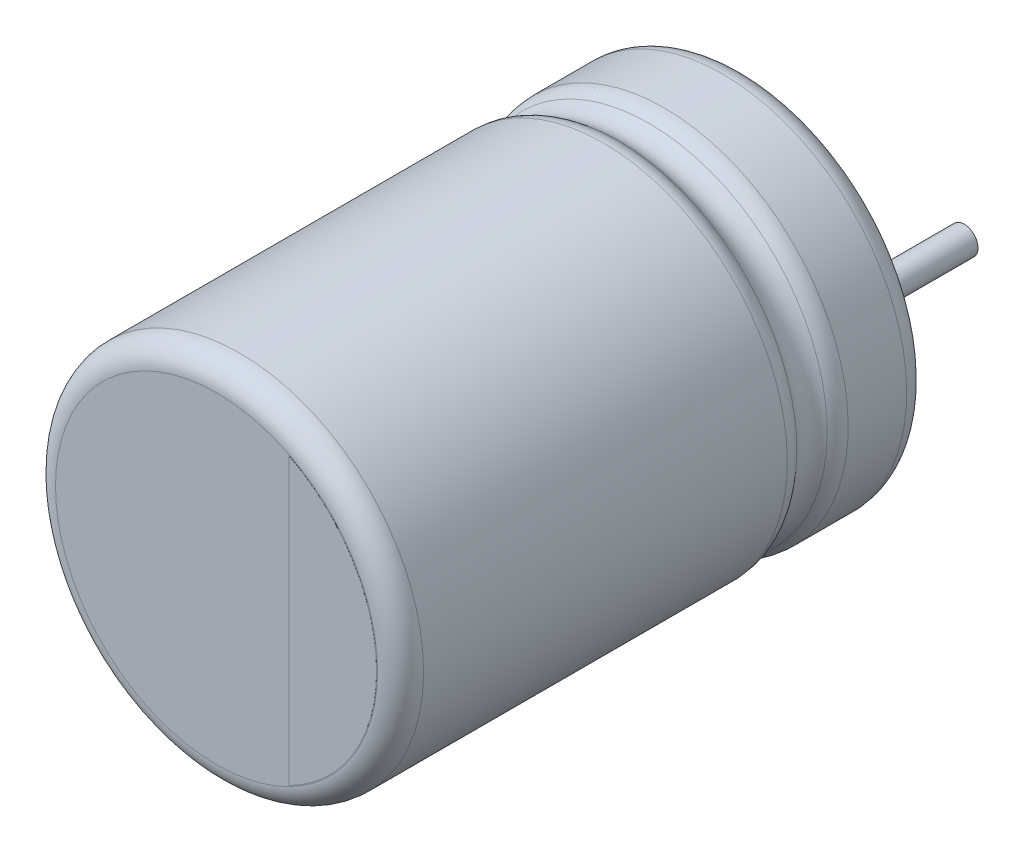
ISO-10303-21;
HEADER;
FILE_DESCRIPTION(('STEP AP214'),'2;1');
FILE_NAME('part.step','',(''),(''),'','','');
FILE_SCHEMA(('AUTOMOTIVE_DESIGN { 1 0 10303 214 1 1 1 1 }'));
ENDSEC;
DATA;
#1=APPLICATION_CONTEXT('core data for automotive mechanical design processes');
#2=APPLICATION_PROTOCOL_DEFINITION('international standard','automotive_design',2000,#1);
#3=PRODUCT_CONTEXT('',#1,'mechanical');
#4=PRODUCT('Part','Part','',(#3));
#5=PRODUCT_RELATED_PRODUCT_CATEGORY('part','',(#4));
#6=PRODUCT_DEFINITION_FORMATION('','',#4);
#7=PRODUCT_DEFINITION_CONTEXT('part definition',#1,'design');
#8=PRODUCT_DEFINITION('design','',#6,#7);
#9=PRODUCT_DEFINITION_SHAPE('','',#8);
#10=(LENGTH_UNIT() NAMED_UNIT(*) SI_UNIT(.MILLI.,.METRE.));
#11=(NAMED_UNIT(*) PLANE_ANGLE_UNIT() SI_UNIT($,.RADIAN.));
#12=(NAMED_UNIT(*) SI_UNIT($,.STERADIAN.) SOLID_ANGLE_UNIT());
#13=UNCERTAINTY_MEASURE_WITH_UNIT(LENGTH_MEASURE(1.E-05),#10,'distance_accuracy_value','');
#14=(GEOMETRIC_REPRESENTATION_CONTEXT(3) GLOBAL_UNCERTAINTY_ASSIGNED_CONTEXT((#13)) GLOBAL_UNIT_ASSIGNED_CONTEXT((#10,
#11,#12)) REPRESENTATION_CONTEXT('',''));
#15=CARTESIAN_POINT('',(0.,0.,0.));
#16=DIRECTION('',(0.,0.,1.));
#17=DIRECTION('',(1.,0.,0.));
#18=AXIS2_PLACEMENT_3D('',#15,#16,#17);
#19=CARTESIAN_POINT('',(3.,0.,11.5));
#20=DIRECTION('',(0.,0.,1.));
#21=DIRECTION('',(1.,0.,0.));
#22=AXIS2_PLACEMENT_3D('',#19,#20,#21);
#23=PLANE('',#22);
#24=CARTESIAN_POINT('',(0.,0.,11.5));
#25=DIRECTION('',(0.,0.,-1.));
#26=DIRECTION('',(0.,1.,0.));
#27=AXIS2_PLACEMENT_3D('',#24,#25,#26);
#28=CIRCLE('',#27,3.5);
#29=CARTESIAN_POINT('',(0.,3.5,11.5));
#30=VERTEX_POINT('',#29);
#31=EDGE_CURVE('E39',#30,#30,#28,.T.);
#32=ORIENTED_EDGE('',*,*,#31,.F.);
#33=EDGE_LOOP('',(#32));
#34=FACE_BOUND('',#33,.T.);
#35=DIRECTION('',(0.,-1.,0.));
#36=VECTOR('',#35,1.);
#37=CARTESIAN_POINT('',(1.5758347232,3.103007768,11.5));
#38=LINE('',#37,#36);
#39=CARTESIAN_POINT('',(1.5758347232,3.103007768,11.5));
#40=VERTEX_POINT('',#39);
#41=CARTESIAN_POINT('',(1.5758347232,-3.103007768,11.5));
#42=VERTEX_POINT('',#41);
#43=EDGE_CURVE('E136',#40,#42,#38,.T.);
#44=ORIENTED_EDGE('',*,*,#43,.F.);
#45=CARTESIAN_POINT('',(0.,0.,11.5));
#46=DIRECTION('',(0.,0.,1.));
#47=DIRECTION('',(1.,0.,0.));
#48=AXIS2_PLACEMENT_3D('',#45,#46,#47);
#49=CIRCLE('',#48,3.4802172753);
#50=EDGE_CURVE('E132',#42,#40,#49,.T.);
#51=ORIENTED_EDGE('',*,*,#50,.F.);
#52=EDGE_LOOP('',(#44,#51));
#53=FACE_BOUND('',#52,.T.);
#54=ADVANCED_FACE('F16',(#34,#53),#23,.T.);
#55=CARTESIAN_POINT('',(3.5,0.,0.));
#56=DIRECTION('',(0.,0.,-1.));
#57=DIRECTION('',(0.,-1.,0.));
#58=AXIS2_PLACEMENT_3D('',#55,#56,#57);
#59=PLANE('',#58);
#60=CARTESIAN_POINT('',(-1.75,0.,0.));
#61=DIRECTION('',(0.,0.,-1.));
#62=DIRECTION('',(0.,1.,0.));
#63=AXIS2_PLACEMENT_3D('',#60,#61,#62);
#64=CIRCLE('',#63,0.3);
#65=CARTESIAN_POINT('',(-1.75,0.3,0.));
#66=VERTEX_POINT('',#65);
#67=EDGE_CURVE('E125',#66,#66,#64,.T.);
#68=ORIENTED_EDGE('',*,*,#67,.F.);
#69=EDGE_LOOP('',(#68));
#70=FACE_BOUND('',#69,.T.);
#71=CARTESIAN_POINT('',(0.,0.,0.));
#72=DIRECTION('',(0.,0.,-1.));
#73=DIRECTION('',(0.,1.,0.));
#74=AXIS2_PLACEMENT_3D('',#71,#72,#73);
#75=CIRCLE('',#74,3.5);
#76=CARTESIAN_POINT('',(0.,3.5,0.));
#77=VERTEX_POINT('',#76);
#78=EDGE_CURVE('E10',#77,#77,#75,.T.);
#79=ORIENTED_EDGE('',*,*,#78,.T.);
#80=EDGE_LOOP('',(#79));
#81=FACE_BOUND('',#80,.T.);
#82=CARTESIAN_POINT('',(1.75,0.,0.));
#83=DIRECTION('',(0.,0.,-1.));
#84=DIRECTION('',(0.,-1.,0.));
#85=AXIS2_PLACEMENT_3D('',#82,#83,#84);
#86=CIRCLE('',#85,0.3);
#87=CARTESIAN_POINT('',(1.75,-0.3,0.));
#88=VERTEX_POINT('',#87);
#89=EDGE_CURVE('E131',#88,#88,#86,.T.);
#90=ORIENTED_EDGE('',*,*,#89,.F.);
#91=EDGE_LOOP('',(#90));
#92=FACE_BOUND('',#91,.T.);
#93=ADVANCED_FACE('F184',(#70,#81,#92),#59,.T.);
#94=CARTESIAN_POINT('',(0.,0.,0.5));
#95=DIRECTION('',(0.,0.,-1.));
#96=DIRECTION('',(0.,1.,0.));
#97=AXIS2_PLACEMENT_3D('',#94,#95,#96);
#98=TOROIDAL_SURFACE('',#97,3.5,0.5);
#99=CARTESIAN_POINT('',(0.,0.,0.5));
#100=DIRECTION('',(0.,0.,-1.));
#101=DIRECTION('',(0.,1.,0.));
#102=AXIS2_PLACEMENT_3D('',#99,#100,#101);
#103=CIRCLE('',#102,4.);
#104=CARTESIAN_POINT('',(0.,4.,0.5));
#105=VERTEX_POINT('',#104);
#106=EDGE_CURVE('E27',#105,#105,#103,.T.);
#107=ORIENTED_EDGE('',*,*,#106,.T.);
#108=EDGE_LOOP('',(#107));
#109=FACE_BOUND('',#108,.T.);
#110=ORIENTED_EDGE('',*,*,#78,.F.);
#111=EDGE_LOOP('',(#110));
#112=FACE_BOUND('',#111,.T.);
#113=ADVANCED_FACE('F180',(#109,#112),#98,.T.);
#114=CARTESIAN_POINT('',(0.,0.,0.));
#115=DIRECTION('',(0.,0.,-1.));
#116=DIRECTION('',(0.,1.,0.));
#117=AXIS2_PLACEMENT_3D('',#114,#115,#116);
#118=CYLINDRICAL_SURFACE('',#117,4.);
#119=CARTESIAN_POINT('',(0.,0.,1.7715748741));
#120=DIRECTION('',(0.,0.,-1.));
#121=DIRECTION('',(0.,1.,0.));
#122=AXIS2_PLACEMENT_3D('',#119,#120,#121);
#123=CIRCLE('',#122,4.);
#124=CARTESIAN_POINT('',(0.,4.,1.7715748741));
#125=VERTEX_POINT('',#124);
#126=EDGE_CURVE('E58',#125,#125,#123,.T.);
#127=ORIENTED_EDGE('',*,*,#126,.T.);
#128=EDGE_LOOP('',(#127));
#129=FACE_BOUND('',#128,.T.);
#130=ORIENTED_EDGE('',*,*,#106,.F.);
#131=EDGE_LOOP('',(#130));
#132=FACE_BOUND('',#131,.T.);
#133=ADVANCED_FACE('F183',(#129,#132),#118,.T.);
#134=CARTESIAN_POINT('',(0.,0.,1.7715748741));
#135=DIRECTION('',(0.,0.,-1.));
#136=DIRECTION('',(0.,1.,0.));
#137=AXIS2_PLACEMENT_3D('',#134,#135,#136);
#138=TOROIDAL_SURFACE('',#137,3.5,0.5);
#139=CARTESIAN_POINT('',(0.,0.,2.102293788));
#140=DIRECTION('',(0.,0.,-1.));
#141=DIRECTION('',(0.,1.,0.));
#142=AXIS2_PLACEMENT_3D('',#139,#140,#141);
#143=CIRCLE('',#142,3.875);
#144=CARTESIAN_POINT('',(0.,3.875,2.102293788));
#145=VERTEX_POINT('',#144);
#146=EDGE_CURVE('E152',#145,#145,#143,.T.);
#147=ORIENTED_EDGE('',*,*,#146,.T.);
#148=EDGE_LOOP('',(#147));
#149=FACE_BOUND('',#148,.T.);
#150=ORIENTED_EDGE('',*,*,#126,.F.);
#151=EDGE_LOOP('',(#150));
#152=FACE_BOUND('',#151,.T.);
#153=ADVANCED_FACE('F369',(#149,#152),#138,.T.);
#154=CARTESIAN_POINT('',(0.,0.,2.4330127019));
#155=DIRECTION('',(0.,0.,-1.));
#156=DIRECTION('',(0.,1.,0.));
#157=AXIS2_PLACEMENT_3D('',#154,#155,#156);
#158=TOROIDAL_SURFACE('',#157,4.25,0.5);
#159=CARTESIAN_POINT('',(0.,0.,2.7637316158));
#160=DIRECTION('',(0.,0.,-1.));
#161=DIRECTION('',(0.,1.,0.));
#162=AXIS2_PLACEMENT_3D('',#159,#160,#161);
#163=CIRCLE('',#162,3.875);
#164=CARTESIAN_POINT('',(0.,3.875,2.7637316158));
#165=VERTEX_POINT('',#164);
#166=EDGE_CURVE('E124',#165,#165,#163,.T.);
#167=ORIENTED_EDGE('',*,*,#166,.T.);
#168=EDGE_LOOP('',(#167));
#169=FACE_BOUND('',#168,.T.);
#170=ORIENTED_EDGE('',*,*,#146,.F.);
#171=EDGE_LOOP('',(#170));
#172=FACE_BOUND('',#171,.T.);
#173=ADVANCED_FACE('F229',(#169,#172),#158,.F.);
#174=CARTESIAN_POINT('',(0.,0.,3.0944505297));
#175=DIRECTION('',(0.,0.,-1.));
#176=DIRECTION('',(0.,1.,0.));
#177=AXIS2_PLACEMENT_3D('',#174,#175,#176);
#178=TOROIDAL_SURFACE('',#177,3.5,0.5);
#179=CARTESIAN_POINT('',(0.,0.,3.0944505297));
#180=DIRECTION('',(0.,0.,-1.));
#181=DIRECTION('',(0.,1.,0.));
#182=AXIS2_PLACEMENT_3D('',#179,#180,#181);
#183=CIRCLE('',#182,4.);
#184=CARTESIAN_POINT('',(0.,4.,3.0944505297));
#185=VERTEX_POINT('',#184);
#186=EDGE_CURVE('E20',#185,#185,#183,.T.);
#187=ORIENTED_EDGE('',*,*,#186,.T.);
#188=EDGE_LOOP('',(#187));
#189=FACE_BOUND('',#188,.T.);
#190=ORIENTED_EDGE('',*,*,#166,.F.);
#191=EDGE_LOOP('',(#190));
#192=FACE_BOUND('',#191,.T.);
#193=ADVANCED_FACE('F221',(#189,#192),#178,.T.);
#194=CARTESIAN_POINT('',(0.,0.,0.));
#195=DIRECTION('',(0.,0.,-1.));
#196=DIRECTION('',(0.,1.,0.));
#197=AXIS2_PLACEMENT_3D('',#194,#195,#196);
#198=CYLINDRICAL_SURFACE('',#197,4.);
#199=CARTESIAN_POINT('',(0.,0.,11.));
#200=DIRECTION('',(0.,0.,-1.));
#201=DIRECTION('',(0.,1.,0.));
#202=AXIS2_PLACEMENT_3D('',#199,#200,#201);
#203=CIRCLE('',#202,4.);
#204=CARTESIAN_POINT('',(0.,4.,11.));
#205=VERTEX_POINT('',#204);
#206=EDGE_CURVE('E113',#205,#205,#203,.T.);
#207=ORIENTED_EDGE('',*,*,#206,.T.);
#208=EDGE_LOOP('',(#207));
#209=FACE_BOUND('',#208,.T.);
#210=ORIENTED_EDGE('',*,*,#186,.F.);
#211=EDGE_LOOP('',(#210));
#212=FACE_BOUND('',#211,.T.);
#213=ADVANCED_FACE('F219',(#209,#212),#198,.T.);
#214=CARTESIAN_POINT('',(0.,0.,11.));
#215=DIRECTION('',(0.,0.,-1.));
#216=DIRECTION('',(0.,1.,0.));
#217=AXIS2_PLACEMENT_3D('',#214,#215,#216);
#218=TOROIDAL_SURFACE('',#217,3.5,0.5);
#219=ORIENTED_EDGE('',*,*,#31,.T.);
#220=EDGE_LOOP('',(#219));
#221=FACE_BOUND('',#220,.T.);
#222=ORIENTED_EDGE('',*,*,#206,.F.);
#223=EDGE_LOOP('',(#222));
#224=FACE_BOUND('',#223,.T.);
#225=ADVANCED_FACE('F114',(#221,#224),#218,.T.);
#226=CARTESIAN_POINT('',(-1.75,0.,-3.));
#227=DIRECTION('',(0.,0.,1.));
#228=DIRECTION('',(0.,-1.,0.));
#229=AXIS2_PLACEMENT_3D('',#226,#227,#228);
#230=CYLINDRICAL_SURFACE('',#229,0.3);
#231=CARTESIAN_POINT('',(-1.75,0.,-3.));
#232=DIRECTION('',(0.,0.,-1.));
#233=DIRECTION('',(0.,1.,0.));
#234=AXIS2_PLACEMENT_3D('',#231,#232,#233);
#235=CIRCLE('',#234,0.3);
#236=CARTESIAN_POINT('',(-1.75,0.3,-3.));
#237=VERTEX_POINT('',#236);
#238=EDGE_CURVE('E138',#237,#237,#235,.T.);
#239=ORIENTED_EDGE('',*,*,#238,.F.);
#240=EDGE_LOOP('',(#239));
#241=FACE_BOUND('',#240,.T.);
#242=ORIENTED_EDGE('',*,*,#67,.T.);
#243=EDGE_LOOP('',(#242));
#244=FACE_BOUND('',#243,.T.);
#245=ADVANCED_FACE('F205',(#241,#244),#230,.T.);
#246=CARTESIAN_POINT('',(-1.75,0.,-3.));
#247=DIRECTION('',(0.,0.,-1.));
#248=DIRECTION('',(0.,-1.,0.));
#249=AXIS2_PLACEMENT_3D('',#246,#247,#248);
#250=PLANE('',#249);
#251=ORIENTED_EDGE('',*,*,#238,.T.);
#252=EDGE_LOOP('',(#251));
#253=FACE_BOUND('',#252,.T.);
#254=ADVANCED_FACE('F18',(#253),#250,.T.);
#255=CARTESIAN_POINT('',(1.75,0.,-3.));
#256=DIRECTION('',(0.,0.,1.));
#257=DIRECTION('',(0.,-1.,0.));
#258=AXIS2_PLACEMENT_3D('',#255,#256,#257);
#259=CYLINDRICAL_SURFACE('',#258,0.3);
#260=CARTESIAN_POINT('',(1.75,0.,-3.));
#261=DIRECTION('',(0.,0.,-1.));
#262=DIRECTION('',(0.,-1.,0.));
#263=AXIS2_PLACEMENT_3D('',#260,#261,#262);
#264=CIRCLE('',#263,0.3);
#265=CARTESIAN_POINT('',(1.75,-0.3,-3.));
#266=VERTEX_POINT('',#265);
#267=EDGE_CURVE('E84',#266,#266,#264,.T.);
#268=ORIENTED_EDGE('',*,*,#267,.F.);
#269=EDGE_LOOP('',(#268));
#270=FACE_BOUND('',#269,.T.);
#271=ORIENTED_EDGE('',*,*,#89,.T.);
#272=EDGE_LOOP('',(#271));
#273=FACE_BOUND('',#272,.T.);
#274=ADVANCED_FACE('F191',(#270,#273),#259,.T.);
#275=CARTESIAN_POINT('',(1.75,0.,-3.));
#276=DIRECTION('',(0.,0.,1.));
#277=DIRECTION('',(1.,0.,0.));
#278=AXIS2_PLACEMENT_3D('',#275,#276,#277);
#279=PLANE('',#278);
#280=ORIENTED_EDGE('',*,*,#267,.T.);
#281=EDGE_LOOP('',(#280));
#282=FACE_BOUND('',#281,.T.);
#283=ADVANCED_FACE('F193',(#282),#279,.F.);
#284=CARTESIAN_POINT('',(0.,0.,11.501));
#285=DIRECTION('',(0.,0.,-1.));
#286=DIRECTION('',(-1.,0.,0.));
#287=AXIS2_PLACEMENT_3D('',#284,#285,#286);
#288=CYLINDRICAL_SURFACE('',#287,3.4802172753);
#289=ORIENTED_EDGE('',*,*,#50,.T.);
#290=DIRECTION('',(0.,0.,-1.));
#291=VECTOR('',#290,1.);
#292=CARTESIAN_POINT('',(1.5758347232,3.103007768,11.501));
#293=LINE('',#292,#291);
#294=CARTESIAN_POINT('',(1.5758347232,3.103007768,11.501));
#295=VERTEX_POINT('',#294);
#296=EDGE_CURVE('E133',#295,#40,#293,.T.);
#297=ORIENTED_EDGE('',*,*,#296,.F.);
#298=CARTESIAN_POINT('',(0.,0.,11.501));
#299=DIRECTION('',(0.,0.,1.));
#300=DIRECTION('',(1.,0.,0.));
#301=AXIS2_PLACEMENT_3D('',#298,#299,#300);
#302=CIRCLE('',#301,3.4802172753);
#303=CARTESIAN_POINT('',(1.5758347232,-3.103007768,11.501));
#304=VERTEX_POINT('',#303);
#305=EDGE_CURVE('E95',#304,#295,#302,.T.);
#306=ORIENTED_EDGE('',*,*,#305,.F.);
#307=DIRECTION('',(0.,0.,-1.));
#308=VECTOR('',#307,1.);
#309=CARTESIAN_POINT('',(1.5758347232,-3.103007768,11.501));
#310=LINE('',#309,#308);
#311=EDGE_CURVE('E153',#304,#42,#310,.T.);
#312=ORIENTED_EDGE('',*,*,#311,.T.);
#313=EDGE_LOOP('',(#289,#297,#306,#312));
#314=FACE_BOUND('',#313,.T.);
#315=ADVANCED_FACE('F201',(#314),#288,.T.);
#316=CARTESIAN_POINT('',(1.5758347232,3.103007768,11.501));
#317=DIRECTION('',(1.,0.,0.));
#318=DIRECTION('',(0.,1.,0.));
#319=AXIS2_PLACEMENT_3D('',#316,#317,#318);
#320=PLANE('',#319);
#321=ORIENTED_EDGE('',*,*,#43,.T.);
#322=ORIENTED_EDGE('',*,*,#311,.F.);
#323=DIRECTION('',(0.,-1.,0.));
#324=VECTOR('',#323,1.);
#325=CARTESIAN_POINT('',(1.5758347232,3.103007768,11.501));
#326=LINE('',#325,#324);
#327=EDGE_CURVE('E145',#295,#304,#326,.T.);
#328=ORIENTED_EDGE('',*,*,#327,.F.);
#329=ORIENTED_EDGE('',*,*,#296,.T.);
#330=EDGE_LOOP('',(#321,#322,#328,#329));
#331=FACE_BOUND('',#330,.T.);
#332=ADVANCED_FACE('F286',(#331),#320,.F.);
#333=CARTESIAN_POINT('',(0.,0.,11.501));
#334=DIRECTION('',(0.,0.,1.));
#335=DIRECTION('',(1.,0.,0.));
#336=AXIS2_PLACEMENT_3D('',#333,#334,#335);
#337=PLANE('',#336);
#338=ORIENTED_EDGE('',*,*,#305,.T.);
#339=ORIENTED_EDGE('',*,*,#327,.T.);
#340=EDGE_LOOP('',(#338,#339));
#341=FACE_BOUND('',#340,.T.);
#342=ADVANCED_FACE('F217',(#341),#337,.T.);
#343=CLOSED_SHELL('',(#54,#93,#113,#133,#153,#173,#193,#213,#225,#245,#254,#274,#283,#315,#332,#342));
#344=MANIFOLD_SOLID_BREP('B1',#343);
#345=ADVANCED_BREP_SHAPE_REPRESENTATION('',(#18,#344),#14);
#346=SHAPE_DEFINITION_REPRESENTATION(#9,#345);
ENDSEC;
END-ISO-10303-21;
